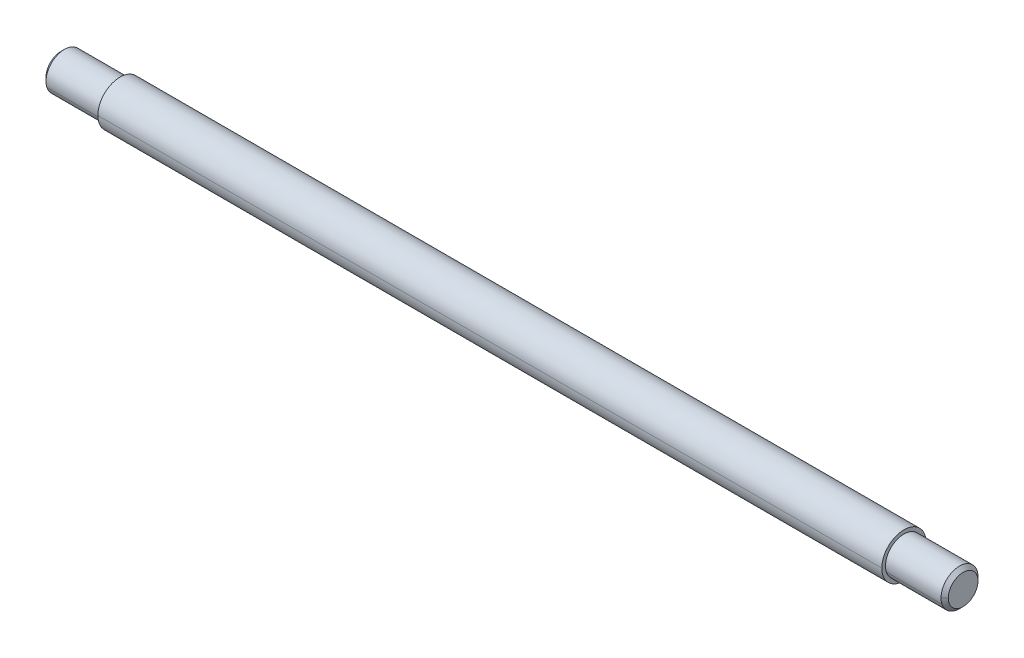
ISO-10303-21;
HEADER;
FILE_DESCRIPTION(('STEP AP214'),'2;1');
FILE_NAME('part.step','',(''),(''),'','','');
FILE_SCHEMA(('AUTOMOTIVE_DESIGN { 1 0 10303 214 1 1 1 1 }'));
ENDSEC;
DATA;
#1=APPLICATION_CONTEXT('core data for automotive mechanical design processes');
#2=APPLICATION_PROTOCOL_DEFINITION('international standard','automotive_design',2000,#1);
#3=PRODUCT_CONTEXT('',#1,'mechanical');
#4=PRODUCT('Part','Part','',(#3));
#5=PRODUCT_RELATED_PRODUCT_CATEGORY('part','',(#4));
#6=PRODUCT_DEFINITION_FORMATION('','',#4);
#7=PRODUCT_DEFINITION_CONTEXT('part definition',#1,'design');
#8=PRODUCT_DEFINITION('design','',#6,#7);
#9=PRODUCT_DEFINITION_SHAPE('','',#8);
#10=(LENGTH_UNIT() NAMED_UNIT(*) SI_UNIT(.MILLI.,.METRE.));
#11=(NAMED_UNIT(*) PLANE_ANGLE_UNIT() SI_UNIT($,.RADIAN.));
#12=(NAMED_UNIT(*) SI_UNIT($,.STERADIAN.) SOLID_ANGLE_UNIT());
#13=UNCERTAINTY_MEASURE_WITH_UNIT(LENGTH_MEASURE(1.E-05),#10,'distance_accuracy_value','');
#14=(GEOMETRIC_REPRESENTATION_CONTEXT(3) GLOBAL_UNCERTAINTY_ASSIGNED_CONTEXT((#13)) GLOBAL_UNIT_ASSIGNED_CONTEXT((#10,
#11,#12)) REPRESENTATION_CONTEXT('',''));
#15=CARTESIAN_POINT('',(0.,0.,0.));
#16=DIRECTION('',(0.,0.,1.));
#17=DIRECTION('',(1.,0.,0.));
#18=AXIS2_PLACEMENT_3D('',#15,#16,#17);
#19=CARTESIAN_POINT('',(-114.,0.,0.));
#20=DIRECTION('',(1.,0.,0.));
#21=DIRECTION('',(0.,0.,-1.));
#22=AXIS2_PLACEMENT_3D('',#19,#20,#21);
#23=PLANE('',#22);
#24=CARTESIAN_POINT('',(-114.,0.,0.));
#25=DIRECTION('',(1.,0.,0.));
#26=DIRECTION('',(0.,0.,-1.));
#27=AXIS2_PLACEMENT_3D('',#24,#25,#26);
#28=CIRCLE('',#27,2.0095);
#29=CARTESIAN_POINT('',(-114.,0.,2.0095));
#30=VERTEX_POINT('',#29);
#31=CARTESIAN_POINT('',(-114.,0.,-2.0095));
#32=VERTEX_POINT('',#31);
#33=EDGE_CURVE('E11',#30,#32,#28,.T.);
#34=ORIENTED_EDGE('',*,*,#33,.F.);
#35=CARTESIAN_POINT('',(-114.,0.,0.));
#36=DIRECTION('',(1.,0.,0.));
#37=DIRECTION('',(0.,0.,-1.));
#38=AXIS2_PLACEMENT_3D('',#35,#36,#37);
#39=CIRCLE('',#38,2.0095);
#40=EDGE_CURVE('E25',#32,#30,#39,.T.);
#41=ORIENTED_EDGE('',*,*,#40,.F.);
#42=EDGE_LOOP('',(#34,#41));
#43=FACE_BOUND('',#42,.T.);
#44=ADVANCED_FACE('F17',(#43),#23,.F.);
#45=CARTESIAN_POINT('',(-114.,0.,0.));
#46=DIRECTION('',(1.,0.,0.));
#47=DIRECTION('',(0.,-1.,0.));
#48=AXIS2_PLACEMENT_3D('',#45,#46,#47);
#49=CONICAL_SURFACE('',#48,2.0095,0.785398163397443);
#50=DIRECTION('',(0.707106781186548,0.,0.707106781186547));
#51=VECTOR('',#50,1.);
#52=CARTESIAN_POINT('',(-114.,0.,2.0095));
#53=LINE('',#52,#51);
#54=CARTESIAN_POINT('',(-113.5095,0.,2.5));
#55=VERTEX_POINT('',#54);
#56=EDGE_CURVE('E210',#30,#55,#53,.T.);
#57=ORIENTED_EDGE('',*,*,#56,.T.);
#58=CARTESIAN_POINT('',(-113.5095,0.,0.));
#59=DIRECTION('',(1.,0.,0.));
#60=DIRECTION('',(0.,0.,-1.));
#61=AXIS2_PLACEMENT_3D('',#58,#59,#60);
#62=CIRCLE('',#61,2.5);
#63=CARTESIAN_POINT('',(-113.5095,0.,-2.5));
#64=VERTEX_POINT('',#63);
#65=EDGE_CURVE('E205',#64,#55,#62,.T.);
#66=ORIENTED_EDGE('',*,*,#65,.F.);
#67=DIRECTION('',(0.707106781186548,0.,-0.707106781186547));
#68=VECTOR('',#67,1.);
#69=CARTESIAN_POINT('',(-114.,0.,-2.0095));
#70=LINE('',#69,#68);
#71=EDGE_CURVE('E200',#32,#64,#70,.T.);
#72=ORIENTED_EDGE('',*,*,#71,.F.);
#73=ORIENTED_EDGE('',*,*,#40,.T.);
#74=EDGE_LOOP('',(#57,#66,#72,#73));
#75=FACE_BOUND('',#74,.T.);
#76=ADVANCED_FACE('F219',(#75),#49,.T.);
#77=CARTESIAN_POINT('',(-114.,0.,0.));
#78=DIRECTION('',(1.,0.,0.));
#79=DIRECTION('',(0.,1.,0.));
#80=AXIS2_PLACEMENT_3D('',#77,#78,#79);
#81=CONICAL_SURFACE('',#80,2.0095,0.785398163397443);
#82=ORIENTED_EDGE('',*,*,#56,.F.);
#83=ORIENTED_EDGE('',*,*,#33,.T.);
#84=ORIENTED_EDGE('',*,*,#71,.T.);
#85=CARTESIAN_POINT('',(-113.5095,0.,0.));
#86=DIRECTION('',(1.,0.,0.));
#87=DIRECTION('',(0.,0.,-1.));
#88=AXIS2_PLACEMENT_3D('',#85,#86,#87);
#89=CIRCLE('',#88,2.5);
#90=CARTESIAN_POINT('',(-113.5095,-0.772542485937367,2.37764129073788));
#91=VERTEX_POINT('',#90);
#92=EDGE_CURVE('E195',#91,#64,#89,.T.);
#93=ORIENTED_EDGE('',*,*,#92,.F.);
#94=CARTESIAN_POINT('',(-113.5095,0.,0.));
#95=DIRECTION('',(1.,0.,0.));
#96=DIRECTION('',(0.,0.,-1.));
#97=AXIS2_PLACEMENT_3D('',#94,#95,#96);
#98=CIRCLE('',#97,2.5);
#99=EDGE_CURVE('E190',#55,#91,#98,.T.);
#100=ORIENTED_EDGE('',*,*,#99,.F.);
#101=EDGE_LOOP('',(#82,#83,#84,#93,#100));
#102=FACE_BOUND('',#101,.T.);
#103=ADVANCED_FACE('F222',(#102),#81,.T.);
#104=CARTESIAN_POINT('',(0.,0.,0.));
#105=DIRECTION('',(1.,0.,0.));
#106=DIRECTION('',(0.,-0.987688340595138,-0.156434465040231));
#107=AXIS2_PLACEMENT_3D('',#104,#105,#106);
#108=CYLINDRICAL_SURFACE('',#107,2.5);
#109=DIRECTION('',(1.,0.,0.));
#110=VECTOR('',#109,1.);
#111=CARTESIAN_POINT('',(-113.5095,-0.772542485937367,2.37764129073788));
#112=LINE('',#111,#110);
#113=CARTESIAN_POINT('',(-106.,-0.772542485937367,2.37764129073788));
#114=VERTEX_POINT('',#113);
#115=EDGE_CURVE('E186',#91,#114,#112,.T.);
#116=ORIENTED_EDGE('',*,*,#115,.T.);
#117=CARTESIAN_POINT('',(-106.,0.,0.));
#118=DIRECTION('',(1.,0.,0.));
#119=DIRECTION('',(0.,0.,-1.));
#120=AXIS2_PLACEMENT_3D('',#117,#118,#119);
#121=CIRCLE('',#120,2.5);
#122=CARTESIAN_POINT('',(-106.,0.,-2.5));
#123=VERTEX_POINT('',#122);
#124=EDGE_CURVE('E181',#123,#114,#121,.T.);
#125=ORIENTED_EDGE('',*,*,#124,.F.);
#126=DIRECTION('',(1.,0.,0.));
#127=VECTOR('',#126,1.);
#128=CARTESIAN_POINT('',(-113.5095,0.,-2.5));
#129=LINE('',#128,#127);
#130=EDGE_CURVE('E176',#64,#123,#129,.T.);
#131=ORIENTED_EDGE('',*,*,#130,.F.);
#132=ORIENTED_EDGE('',*,*,#65,.T.);
#133=ORIENTED_EDGE('',*,*,#99,.T.);
#134=EDGE_LOOP('',(#116,#125,#131,#132,#133));
#135=FACE_BOUND('',#134,.T.);
#136=ADVANCED_FACE('F226',(#135),#108,.T.);
#137=CARTESIAN_POINT('',(0.,0.,0.));
#138=DIRECTION('',(1.,0.,0.));
#139=DIRECTION('',(0.,0.987688340595138,0.156434465040231));
#140=AXIS2_PLACEMENT_3D('',#137,#138,#139);
#141=CYLINDRICAL_SURFACE('',#140,2.5);
#142=ORIENTED_EDGE('',*,*,#115,.F.);
#143=ORIENTED_EDGE('',*,*,#92,.T.);
#144=ORIENTED_EDGE('',*,*,#130,.T.);
#145=CARTESIAN_POINT('',(-106.,0.,0.));
#146=DIRECTION('',(1.,0.,0.));
#147=DIRECTION('',(0.,0.,-1.));
#148=AXIS2_PLACEMENT_3D('',#145,#146,#147);
#149=CIRCLE('',#148,2.5);
#150=EDGE_CURVE('E171',#114,#123,#149,.T.);
#151=ORIENTED_EDGE('',*,*,#150,.F.);
#152=EDGE_LOOP('',(#142,#143,#144,#151));
#153=FACE_BOUND('',#152,.T.);
#154=ADVANCED_FACE('F229',(#153),#141,.T.);
#155=CARTESIAN_POINT('',(-106.,2.5,0.));
#156=DIRECTION('',(1.,0.,0.));
#157=DIRECTION('',(0.,0.,-1.));
#158=AXIS2_PLACEMENT_3D('',#155,#156,#157);
#159=PLANE('',#158);
#160=CARTESIAN_POINT('',(-106.,0.,0.));
#161=DIRECTION('',(1.,0.,0.));
#162=DIRECTION('',(0.,0.,-1.));
#163=AXIS2_PLACEMENT_3D('',#160,#161,#162);
#164=CIRCLE('',#163,3.);
#165=CARTESIAN_POINT('',(-106.,0.,3.));
#166=VERTEX_POINT('',#165);
#167=CARTESIAN_POINT('',(-106.,0.,-3.));
#168=VERTEX_POINT('',#167);
#169=EDGE_CURVE('E166',#166,#168,#164,.T.);
#170=ORIENTED_EDGE('',*,*,#169,.F.);
#171=CARTESIAN_POINT('',(-106.,0.,0.));
#172=DIRECTION('',(1.,0.,0.));
#173=DIRECTION('',(0.,0.,-1.));
#174=AXIS2_PLACEMENT_3D('',#171,#172,#173);
#175=CIRCLE('',#174,3.);
#176=EDGE_CURVE('E161',#168,#166,#175,.T.);
#177=ORIENTED_EDGE('',*,*,#176,.F.);
#178=EDGE_LOOP('',(#170,#177));
#179=FACE_BOUND('',#178,.T.);
#180=ORIENTED_EDGE('',*,*,#124,.T.);
#181=ORIENTED_EDGE('',*,*,#150,.T.);
#182=EDGE_LOOP('',(#180,#181));
#183=FACE_BOUND('',#182,.T.);
#184=ADVANCED_FACE('F231',(#179,#183),#159,.F.);
#185=CARTESIAN_POINT('',(0.,0.,0.));
#186=DIRECTION('',(1.,0.,0.));
#187=DIRECTION('',(0.,-1.,0.));
#188=AXIS2_PLACEMENT_3D('',#185,#186,#187);
#189=CYLINDRICAL_SURFACE('',#188,3.);
#190=DIRECTION('',(1.,0.,0.));
#191=VECTOR('',#190,1.);
#192=CARTESIAN_POINT('',(-106.,0.,3.));
#193=LINE('',#192,#191);
#194=CARTESIAN_POINT('',(0.,0.,3.));
#195=VERTEX_POINT('',#194);
#196=EDGE_CURVE('E157',#166,#195,#193,.T.);
#197=ORIENTED_EDGE('',*,*,#196,.T.);
#198=CARTESIAN_POINT('',(0.,0.,0.));
#199=DIRECTION('',(1.,0.,0.));
#200=DIRECTION('',(0.,0.,-1.));
#201=AXIS2_PLACEMENT_3D('',#198,#199,#200);
#202=CIRCLE('',#201,3.);
#203=CARTESIAN_POINT('',(0.,0.,-3.));
#204=VERTEX_POINT('',#203);
#205=EDGE_CURVE('E152',#204,#195,#202,.T.);
#206=ORIENTED_EDGE('',*,*,#205,.F.);
#207=DIRECTION('',(1.,0.,0.));
#208=VECTOR('',#207,1.);
#209=CARTESIAN_POINT('',(-106.,0.,-3.));
#210=LINE('',#209,#208);
#211=EDGE_CURVE('E147',#168,#204,#210,.T.);
#212=ORIENTED_EDGE('',*,*,#211,.F.);
#213=ORIENTED_EDGE('',*,*,#176,.T.);
#214=EDGE_LOOP('',(#197,#206,#212,#213));
#215=FACE_BOUND('',#214,.T.);
#216=ADVANCED_FACE('F233',(#215),#189,.T.);
#217=CARTESIAN_POINT('',(0.,0.,0.));
#218=DIRECTION('',(1.,0.,0.));
#219=DIRECTION('',(0.,1.,0.));
#220=AXIS2_PLACEMENT_3D('',#217,#218,#219);
#221=CYLINDRICAL_SURFACE('',#220,3.);
#222=ORIENTED_EDGE('',*,*,#196,.F.);
#223=ORIENTED_EDGE('',*,*,#169,.T.);
#224=ORIENTED_EDGE('',*,*,#211,.T.);
#225=CARTESIAN_POINT('',(0.,0.,0.));
#226=DIRECTION('',(1.,0.,0.));
#227=DIRECTION('',(0.,0.,-1.));
#228=AXIS2_PLACEMENT_3D('',#225,#226,#227);
#229=CIRCLE('',#228,3.);
#230=EDGE_CURVE('E142',#195,#204,#229,.T.);
#231=ORIENTED_EDGE('',*,*,#230,.F.);
#232=EDGE_LOOP('',(#222,#223,#224,#231));
#233=FACE_BOUND('',#232,.T.);
#234=ADVANCED_FACE('F241',(#233),#221,.T.);
#235=CARTESIAN_POINT('',(0.,3.,0.));
#236=DIRECTION('',(-1.,0.,0.));
#237=DIRECTION('',(0.,0.,1.));
#238=AXIS2_PLACEMENT_3D('',#235,#236,#237);
#239=PLANE('',#238);
#240=CARTESIAN_POINT('',(0.,0.,0.));
#241=DIRECTION('',(1.,0.,0.));
#242=DIRECTION('',(0.,0.,-1.));
#243=AXIS2_PLACEMENT_3D('',#240,#241,#242);
#244=CIRCLE('',#243,2.5);
#245=CARTESIAN_POINT('',(0.,-0.772542485937367,2.37764129073788));
#246=VERTEX_POINT('',#245);
#247=CARTESIAN_POINT('',(0.,0.,-2.5));
#248=VERTEX_POINT('',#247);
#249=EDGE_CURVE('E137',#246,#248,#244,.T.);
#250=ORIENTED_EDGE('',*,*,#249,.F.);
#251=CARTESIAN_POINT('',(0.,0.,0.));
#252=DIRECTION('',(1.,0.,0.));
#253=DIRECTION('',(0.,0.,-1.));
#254=AXIS2_PLACEMENT_3D('',#251,#252,#253);
#255=CIRCLE('',#254,2.5);
#256=EDGE_CURVE('E132',#248,#246,#255,.T.);
#257=ORIENTED_EDGE('',*,*,#256,.F.);
#258=EDGE_LOOP('',(#250,#257));
#259=FACE_BOUND('',#258,.T.);
#260=ORIENTED_EDGE('',*,*,#205,.T.);
#261=ORIENTED_EDGE('',*,*,#230,.T.);
#262=EDGE_LOOP('',(#260,#261));
#263=FACE_BOUND('',#262,.T.);
#264=ADVANCED_FACE('F290',(#259,#263),#239,.F.);
#265=CARTESIAN_POINT('',(8.,0.,0.));
#266=DIRECTION('',(1.,0.,0.));
#267=DIRECTION('',(0.,-0.987688340595138,-0.156434465040231));
#268=AXIS2_PLACEMENT_3D('',#265,#266,#267);
#269=CYLINDRICAL_SURFACE('',#268,2.5);
#270=DIRECTION('',(1.,0.,0.));
#271=VECTOR('',#270,1.);
#272=CARTESIAN_POINT('',(0.,-0.772542485937367,2.37764129073788));
#273=LINE('',#272,#271);
#274=CARTESIAN_POINT('',(7.5095,-0.772542485937367,2.37764129073788));
#275=VERTEX_POINT('',#274);
#276=EDGE_CURVE('E128',#246,#275,#273,.T.);
#277=ORIENTED_EDGE('',*,*,#276,.T.);
#278=CARTESIAN_POINT('',(7.5095,0.,0.));
#279=DIRECTION('',(1.,0.,0.));
#280=DIRECTION('',(0.,0.,-1.));
#281=AXIS2_PLACEMENT_3D('',#278,#279,#280);
#282=CIRCLE('',#281,2.5);
#283=CARTESIAN_POINT('',(7.5095,0.,2.5));
#284=VERTEX_POINT('',#283);
#285=EDGE_CURVE('E124',#284,#275,#282,.T.);
#286=ORIENTED_EDGE('',*,*,#285,.F.);
#287=CARTESIAN_POINT('',(7.5095,0.,0.));
#288=DIRECTION('',(1.,0.,0.));
#289=DIRECTION('',(0.,0.,-1.));
#290=AXIS2_PLACEMENT_3D('',#287,#288,#289);
#291=CIRCLE('',#290,2.5);
#292=CARTESIAN_POINT('',(7.5095,0.,-2.5));
#293=VERTEX_POINT('',#292);
#294=EDGE_CURVE('E102',#293,#284,#291,.T.);
#295=ORIENTED_EDGE('',*,*,#294,.F.);
#296=DIRECTION('',(1.,0.,0.));
#297=VECTOR('',#296,1.);
#298=CARTESIAN_POINT('',(0.,0.,-2.5));
#299=LINE('',#298,#297);
#300=EDGE_CURVE('E116',#248,#293,#299,.T.);
#301=ORIENTED_EDGE('',*,*,#300,.F.);
#302=ORIENTED_EDGE('',*,*,#256,.T.);
#303=EDGE_LOOP('',(#277,#286,#295,#301,#302));
#304=FACE_BOUND('',#303,.T.);
#305=ADVANCED_FACE('F301',(#304),#269,.T.);
#306=CARTESIAN_POINT('',(8.,0.,0.));
#307=DIRECTION('',(1.,0.,0.));
#308=DIRECTION('',(0.,0.987688340595138,0.156434465040231));
#309=AXIS2_PLACEMENT_3D('',#306,#307,#308);
#310=CYLINDRICAL_SURFACE('',#309,2.5);
#311=ORIENTED_EDGE('',*,*,#276,.F.);
#312=ORIENTED_EDGE('',*,*,#249,.T.);
#313=ORIENTED_EDGE('',*,*,#300,.T.);
#314=CARTESIAN_POINT('',(7.5095,0.,0.));
#315=DIRECTION('',(1.,0.,0.));
#316=DIRECTION('',(0.,0.,-1.));
#317=AXIS2_PLACEMENT_3D('',#314,#315,#316);
#318=CIRCLE('',#317,2.5);
#319=EDGE_CURVE('E112',#275,#293,#318,.T.);
#320=ORIENTED_EDGE('',*,*,#319,.F.);
#321=EDGE_LOOP('',(#311,#312,#313,#320));
#322=FACE_BOUND('',#321,.T.);
#323=ADVANCED_FACE('F312',(#322),#310,.T.);
#324=CARTESIAN_POINT('',(7.5095,0.,0.));
#325=DIRECTION('',(-1.,0.,0.));
#326=DIRECTION('',(0.,1.,0.));
#327=AXIS2_PLACEMENT_3D('',#324,#325,#326);
#328=CONICAL_SURFACE('',#327,2.5,0.785398163397448);
#329=DIRECTION('',(-0.707106781186548,0.,-0.707106781186548));
#330=VECTOR('',#329,1.);
#331=CARTESIAN_POINT('',(8.,0.,-2.0095));
#332=LINE('',#331,#330);
#333=CARTESIAN_POINT('',(8.,0.,-2.0095));
#334=VERTEX_POINT('',#333);
#335=EDGE_CURVE('E93',#334,#293,#332,.T.);
#336=ORIENTED_EDGE('',*,*,#335,.F.);
#337=CARTESIAN_POINT('',(8.,0.,0.));
#338=DIRECTION('',(1.,0.,0.));
#339=DIRECTION('',(0.,0.,-1.));
#340=AXIS2_PLACEMENT_3D('',#337,#338,#339);
#341=CIRCLE('',#340,2.0095);
#342=CARTESIAN_POINT('',(8.,0.,2.0095));
#343=VERTEX_POINT('',#342);
#344=EDGE_CURVE('E84',#343,#334,#341,.T.);
#345=ORIENTED_EDGE('',*,*,#344,.F.);
#346=DIRECTION('',(-0.707106781186548,0.,0.707106781186548));
#347=VECTOR('',#346,1.);
#348=CARTESIAN_POINT('',(8.,0.,2.0095));
#349=LINE('',#348,#347);
#350=EDGE_CURVE('E89',#343,#284,#349,.T.);
#351=ORIENTED_EDGE('',*,*,#350,.T.);
#352=ORIENTED_EDGE('',*,*,#285,.T.);
#353=ORIENTED_EDGE('',*,*,#319,.T.);
#354=EDGE_LOOP('',(#336,#345,#351,#352,#353));
#355=FACE_BOUND('',#354,.T.);
#356=ADVANCED_FACE('F86',(#355),#328,.T.);
#357=CARTESIAN_POINT('',(7.5095,0.,0.));
#358=DIRECTION('',(-1.,0.,0.));
#359=DIRECTION('',(0.,-1.,0.));
#360=AXIS2_PLACEMENT_3D('',#357,#358,#359);
#361=CONICAL_SURFACE('',#360,2.5,0.785398163397448);
#362=ORIENTED_EDGE('',*,*,#335,.T.);
#363=ORIENTED_EDGE('',*,*,#294,.T.);
#364=ORIENTED_EDGE('',*,*,#350,.F.);
#365=CARTESIAN_POINT('',(8.,0.,0.));
#366=DIRECTION('',(1.,0.,0.));
#367=DIRECTION('',(0.,0.,-1.));
#368=AXIS2_PLACEMENT_3D('',#365,#366,#367);
#369=CIRCLE('',#368,2.0095);
#370=EDGE_CURVE('E97',#334,#343,#369,.T.);
#371=ORIENTED_EDGE('',*,*,#370,.F.);
#372=EDGE_LOOP('',(#362,#363,#364,#371));
#373=FACE_BOUND('',#372,.T.);
#374=ADVANCED_FACE('F101',(#373),#361,.T.);
#375=CARTESIAN_POINT('',(8.,2.0095,0.));
#376=DIRECTION('',(-1.,0.,0.));
#377=DIRECTION('',(0.,0.,1.));
#378=AXIS2_PLACEMENT_3D('',#375,#376,#377);
#379=PLANE('',#378);
#380=ORIENTED_EDGE('',*,*,#370,.T.);
#381=ORIENTED_EDGE('',*,*,#344,.T.);
#382=EDGE_LOOP('',(#380,#381));
#383=FACE_BOUND('',#382,.T.);
#384=ADVANCED_FACE('F98',(#383),#379,.F.);
#385=CLOSED_SHELL('',(#44,#76,#103,#136,#154,#184,#216,#234,#264,#305,#323,#356,#374,#384));
#386=MANIFOLD_SOLID_BREP('B1',#385);
#387=ADVANCED_BREP_SHAPE_REPRESENTATION('',(#18,#386),#14);
#388=SHAPE_DEFINITION_REPRESENTATION(#9,#387);
ENDSEC;
END-ISO-10303-21;
